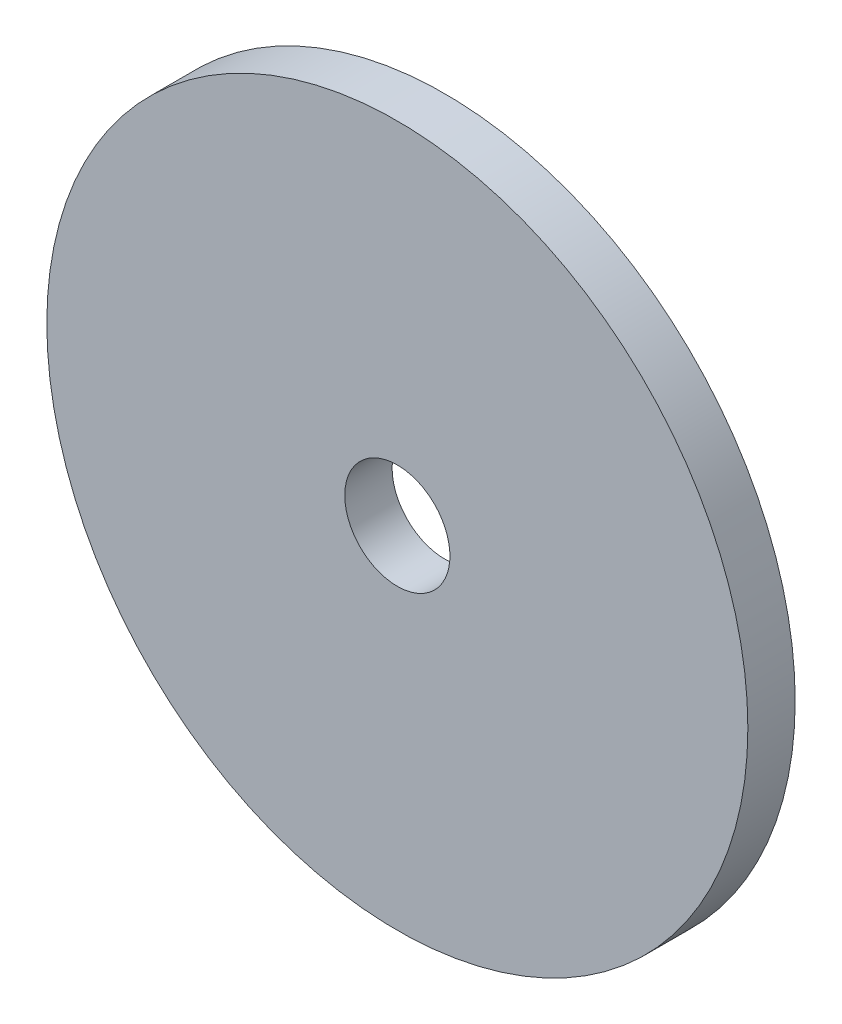
ISO-10303-21;
HEADER;
FILE_DESCRIPTION(('STEP AP214'),'2;1');
FILE_NAME('part.step','',(''),(''),'','','');
FILE_SCHEMA(('AUTOMOTIVE_DESIGN { 1 0 10303 214 1 1 1 1 }'));
ENDSEC;
DATA;
#1=APPLICATION_CONTEXT('core data for automotive mechanical design processes');
#2=APPLICATION_PROTOCOL_DEFINITION('international standard','automotive_design',2000,#1);
#3=PRODUCT_CONTEXT('',#1,'mechanical');
#4=PRODUCT('Part','Part','',(#3));
#5=PRODUCT_RELATED_PRODUCT_CATEGORY('part','',(#4));
#6=PRODUCT_DEFINITION_FORMATION('','',#4);
#7=PRODUCT_DEFINITION_CONTEXT('part definition',#1,'design');
#8=PRODUCT_DEFINITION('design','',#6,#7);
#9=PRODUCT_DEFINITION_SHAPE('','',#8);
#10=(LENGTH_UNIT() NAMED_UNIT(*) SI_UNIT(.MILLI.,.METRE.));
#11=(NAMED_UNIT(*) PLANE_ANGLE_UNIT() SI_UNIT($,.RADIAN.));
#12=(NAMED_UNIT(*) SI_UNIT($,.STERADIAN.) SOLID_ANGLE_UNIT());
#13=UNCERTAINTY_MEASURE_WITH_UNIT(LENGTH_MEASURE(1.E-05),#10,'distance_accuracy_value','');
#14=(GEOMETRIC_REPRESENTATION_CONTEXT(3) GLOBAL_UNCERTAINTY_ASSIGNED_CONTEXT((#13)) GLOBAL_UNIT_ASSIGNED_CONTEXT((#10,
#11,#12)) REPRESENTATION_CONTEXT('',''));
#15=CARTESIAN_POINT('',(0.,0.,0.));
#16=DIRECTION('',(0.,0.,1.));
#17=DIRECTION('',(1.,0.,0.));
#18=AXIS2_PLACEMENT_3D('',#15,#16,#17);
#19=CARTESIAN_POINT('',(-26.0074694451963,-4.9686167072727,2.7));
#20=DIRECTION('',(0.,0.,1.));
#21=DIRECTION('',(1.,0.,0.));
#22=AXIS2_PLACEMENT_3D('',#19,#20,#21);
#23=PLANE('',#22);
#24=CARTESIAN_POINT('',(-26.0074694451963,-4.9686167072727,2.7));
#25=DIRECTION('',(0.,0.,1.));
#26=DIRECTION('',(1.,0.,0.));
#27=AXIS2_PLACEMENT_3D('',#24,#25,#26);
#28=CIRCLE('',#27,20.);
#29=CARTESIAN_POINT('',(-46.0074694451963,-4.9686167072727,2.7));
#30=VERTEX_POINT('',#29);
#31=EDGE_CURVE('E10',#30,#30,#28,.T.);
#32=ORIENTED_EDGE('',*,*,#31,.T.);
#33=EDGE_LOOP('',(#32));
#34=FACE_BOUND('',#33,.T.);
#35=CARTESIAN_POINT('',(-26.0074694451963,-4.9686167072727,2.7));
#36=DIRECTION('',(0.,0.,1.));
#37=DIRECTION('',(1.,0.,0.));
#38=AXIS2_PLACEMENT_3D('',#35,#36,#37);
#39=CIRCLE('',#38,3.);
#40=CARTESIAN_POINT('',(-29.0074694451963,-4.9686167072727,2.7));
#41=VERTEX_POINT('',#40);
#42=EDGE_CURVE('E46',#41,#41,#39,.T.);
#43=ORIENTED_EDGE('',*,*,#42,.F.);
#44=EDGE_LOOP('',(#43));
#45=FACE_BOUND('',#44,.T.);
#46=ADVANCED_FACE('F35',(#34,#45),#23,.T.);
#47=CARTESIAN_POINT('',(-26.0074694451963,-4.9686167072727,0.));
#48=DIRECTION('',(0.,0.,1.));
#49=DIRECTION('',(1.,0.,0.));
#50=AXIS2_PLACEMENT_3D('',#47,#48,#49);
#51=PLANE('',#50);
#52=CARTESIAN_POINT('',(-26.0074694451963,-4.9686167072727,0.));
#53=DIRECTION('',(0.,0.,1.));
#54=DIRECTION('',(1.,0.,0.));
#55=AXIS2_PLACEMENT_3D('',#52,#53,#54);
#56=CIRCLE('',#55,20.);
#57=CARTESIAN_POINT('',(-46.0074694451963,-4.9686167072727,0.));
#58=VERTEX_POINT('',#57);
#59=EDGE_CURVE('E39',#58,#58,#56,.T.);
#60=ORIENTED_EDGE('',*,*,#59,.F.);
#61=EDGE_LOOP('',(#60));
#62=FACE_BOUND('',#61,.T.);
#63=CARTESIAN_POINT('',(-26.0074694451963,-4.9686167072727,0.));
#64=DIRECTION('',(0.,0.,1.));
#65=DIRECTION('',(1.,0.,0.));
#66=AXIS2_PLACEMENT_3D('',#63,#64,#65);
#67=CIRCLE('',#66,3.);
#68=CARTESIAN_POINT('',(-29.0074694451963,-4.9686167072727,0.));
#69=VERTEX_POINT('',#68);
#70=EDGE_CURVE('E48',#69,#69,#67,.T.);
#71=ORIENTED_EDGE('',*,*,#70,.T.);
#72=EDGE_LOOP('',(#71));
#73=FACE_BOUND('',#72,.T.);
#74=ADVANCED_FACE('F58',(#62,#73),#51,.F.);
#75=CARTESIAN_POINT('',(-26.0074694451963,-4.9686167072727,2.7));
#76=DIRECTION('',(0.,0.,-1.));
#77=DIRECTION('',(-1.,0.,0.));
#78=AXIS2_PLACEMENT_3D('',#75,#76,#77);
#79=CYLINDRICAL_SURFACE('',#78,20.);
#80=CARTESIAN_POINT('',(-46.0074694451963,-4.9686167072727,2.7));
#81=CARTESIAN_POINT('',(-46.0074694451963,-4.9686167072727,2.671875));
#82=CARTESIAN_POINT('',(-46.0074694451963,-4.9686167072727,2.64375));
#83=CARTESIAN_POINT('',(-46.0074694451963,-4.9686167072727,2.5875));
#84=CARTESIAN_POINT('',(-46.0074694451963,-4.9686167072727,2.559375));
#85=CARTESIAN_POINT('',(-46.0074694451963,-4.9686167072727,2.503125));
#86=CARTESIAN_POINT('',(-46.0074694451963,-4.9686167072727,2.475));
#87=CARTESIAN_POINT('',(-46.0074694451963,-4.9686167072727,2.41875));
#88=CARTESIAN_POINT('',(-46.0074694451963,-4.9686167072727,2.390625));
#89=CARTESIAN_POINT('',(-46.0074694451963,-4.9686167072727,2.334375));
#90=CARTESIAN_POINT('',(-46.0074694451963,-4.9686167072727,2.30625));
#91=CARTESIAN_POINT('',(-46.0074694451963,-4.9686167072727,2.25));
#92=CARTESIAN_POINT('',(-46.0074694451963,-4.9686167072727,2.221875));
#93=CARTESIAN_POINT('',(-46.0074694451963,-4.9686167072727,2.165625));
#94=CARTESIAN_POINT('',(-46.0074694451963,-4.9686167072727,2.1375));
#95=CARTESIAN_POINT('',(-46.0074694451963,-4.9686167072727,2.08125));
#96=CARTESIAN_POINT('',(-46.0074694451963,-4.9686167072727,2.053125));
#97=CARTESIAN_POINT('',(-46.0074694451963,-4.9686167072727,1.996875));
#98=CARTESIAN_POINT('',(-46.0074694451963,-4.9686167072727,1.96875));
#99=CARTESIAN_POINT('',(-46.0074694451963,-4.9686167072727,1.9125));
#100=CARTESIAN_POINT('',(-46.0074694451963,-4.9686167072727,1.884375));
#101=CARTESIAN_POINT('',(-46.0074694451963,-4.9686167072727,1.828125));
#102=CARTESIAN_POINT('',(-46.0074694451963,-4.9686167072727,1.8));
#103=CARTESIAN_POINT('',(-46.0074694451963,-4.9686167072727,1.74375));
#104=CARTESIAN_POINT('',(-46.0074694451963,-4.9686167072727,1.715625));
#105=CARTESIAN_POINT('',(-46.0074694451963,-4.9686167072727,1.659375));
#106=CARTESIAN_POINT('',(-46.0074694451963,-4.9686167072727,1.63125));
#107=CARTESIAN_POINT('',(-46.0074694451963,-4.9686167072727,1.575));
#108=CARTESIAN_POINT('',(-46.0074694451963,-4.9686167072727,1.546875));
#109=CARTESIAN_POINT('',(-46.0074694451963,-4.9686167072727,1.490625));
#110=CARTESIAN_POINT('',(-46.0074694451963,-4.9686167072727,1.4625));
#111=CARTESIAN_POINT('',(-46.0074694451963,-4.9686167072727,1.40625));
#112=CARTESIAN_POINT('',(-46.0074694451963,-4.9686167072727,1.378125));
#113=CARTESIAN_POINT('',(-46.0074694451963,-4.9686167072727,1.321875));
#114=CARTESIAN_POINT('',(-46.0074694451963,-4.9686167072727,1.29375));
#115=CARTESIAN_POINT('',(-46.0074694451963,-4.9686167072727,1.2375));
#116=CARTESIAN_POINT('',(-46.0074694451963,-4.9686167072727,1.209375));
#117=CARTESIAN_POINT('',(-46.0074694451963,-4.9686167072727,1.153125));
#118=CARTESIAN_POINT('',(-46.0074694451963,-4.9686167072727,1.125));
#119=CARTESIAN_POINT('',(-46.0074694451963,-4.9686167072727,1.06875));
#120=CARTESIAN_POINT('',(-46.0074694451963,-4.9686167072727,1.040625));
#121=CARTESIAN_POINT('',(-46.0074694451963,-4.9686167072727,0.984375));
#122=CARTESIAN_POINT('',(-46.0074694451963,-4.9686167072727,0.95625));
#123=CARTESIAN_POINT('',(-46.0074694451963,-4.9686167072727,0.9));
#124=CARTESIAN_POINT('',(-46.0074694451963,-4.9686167072727,0.871875));
#125=CARTESIAN_POINT('',(-46.0074694451963,-4.9686167072727,0.815625));
#126=CARTESIAN_POINT('',(-46.0074694451963,-4.9686167072727,0.7875));
#127=CARTESIAN_POINT('',(-46.0074694451963,-4.9686167072727,0.73125));
#128=CARTESIAN_POINT('',(-46.0074694451963,-4.9686167072727,0.703125));
#129=CARTESIAN_POINT('',(-46.0074694451963,-4.9686167072727,0.646875));
#130=CARTESIAN_POINT('',(-46.0074694451963,-4.9686167072727,0.61875));
#131=CARTESIAN_POINT('',(-46.0074694451963,-4.9686167072727,0.5625));
#132=CARTESIAN_POINT('',(-46.0074694451963,-4.9686167072727,0.534375));
#133=CARTESIAN_POINT('',(-46.0074694451963,-4.9686167072727,0.478125));
#134=CARTESIAN_POINT('',(-46.0074694451963,-4.9686167072727,0.45));
#135=CARTESIAN_POINT('',(-46.0074694451963,-4.9686167072727,0.39375));
#136=CARTESIAN_POINT('',(-46.0074694451963,-4.9686167072727,0.365625));
#137=CARTESIAN_POINT('',(-46.0074694451963,-4.9686167072727,0.309375));
#138=CARTESIAN_POINT('',(-46.0074694451963,-4.9686167072727,0.28125));
#139=CARTESIAN_POINT('',(-46.0074694451963,-4.9686167072727,0.225));
#140=CARTESIAN_POINT('',(-46.0074694451963,-4.9686167072727,0.196875));
#141=CARTESIAN_POINT('',(-46.0074694451963,-4.9686167072727,0.140625));
#142=CARTESIAN_POINT('',(-46.0074694451963,-4.9686167072727,0.112499999999999));
#143=CARTESIAN_POINT('',(-46.0074694451963,-4.9686167072727,0.0562499999999994));
#144=CARTESIAN_POINT('',(-46.0074694451963,-4.9686167072727,0.0281249999999995));
#145=CARTESIAN_POINT('',(-46.0074694451963,-4.9686167072727,0.));
#146=B_SPLINE_CURVE_WITH_KNOTS('',3,(#80,#81,#82,#83,#84,#85,#86,#87,#88,#89,#90,#91,#92,#93,
#94,#95,#96,#97,#98,#99,#100,#101,#102,#103,#104,#105,#106,#107,#108,#109,#110,#111,#112,#113,
#114,#115,#116,#117,#118,#119,#120,#121,#122,#123,#124,#125,#126,#127,#128,#129,#130,#131,#132,
#133,#134,#135,#136,#137,#138,#139,#140,#141,#142,#143,#144,#145),.UNSPECIFIED.,.F.,.F.,(4,2,2,
2,2,2,2,2,2,2,2,2,2,2,2,2,2,2,2,2,2,2,2,2,2,2,2,2,2,2,2,2,4),(0.,0.0843749999999998,0.16875,
0.253125,0.3375,0.421875,0.50625,0.590625,0.675,0.759375,0.84375,0.928125,1.0125,1.096875,
1.18125,1.265625,1.35,1.434375,1.51875,1.603125,1.6875,1.771875,1.85625,1.940625,2.025,2.109375,
2.19375,2.278125,2.3625,2.446875,2.53125,2.615625,2.7),.UNSPECIFIED.);
#147=EDGE_CURVE('BSEAM37',#30,#58,#146,.T.);
#148=ORIENTED_EDGE('',*,*,#31,.F.);
#149=ORIENTED_EDGE('',*,*,#59,.T.);
#150=ORIENTED_EDGE('',*,*,#147,.T.);
#151=ORIENTED_EDGE('',*,*,#147,.F.);
#152=EDGE_LOOP('',(#148,#150,#149,#151));
#153=FACE_BOUND('',#152,.T.);
#154=ADVANCED_FACE('F37',(#153),#79,.T.);
#155=CARTESIAN_POINT('',(-26.0074694451963,-4.9686167072727,2.7));
#156=DIRECTION('',(0.,0.,-1.));
#157=DIRECTION('',(-1.,0.,0.));
#158=AXIS2_PLACEMENT_3D('',#155,#156,#157);
#159=CYLINDRICAL_SURFACE('',#158,3.);
#160=CARTESIAN_POINT('',(-29.0074694451963,-4.9686167072727,2.7));
#161=CARTESIAN_POINT('',(-29.0074694451963,-4.9686167072727,2.671875));
#162=CARTESIAN_POINT('',(-29.0074694451963,-4.9686167072727,2.64375));
#163=CARTESIAN_POINT('',(-29.0074694451963,-4.9686167072727,2.5875));
#164=CARTESIAN_POINT('',(-29.0074694451963,-4.9686167072727,2.559375));
#165=CARTESIAN_POINT('',(-29.0074694451963,-4.9686167072727,2.503125));
#166=CARTESIAN_POINT('',(-29.0074694451963,-4.9686167072727,2.475));
#167=CARTESIAN_POINT('',(-29.0074694451963,-4.9686167072727,2.41875));
#168=CARTESIAN_POINT('',(-29.0074694451963,-4.9686167072727,2.390625));
#169=CARTESIAN_POINT('',(-29.0074694451963,-4.9686167072727,2.334375));
#170=CARTESIAN_POINT('',(-29.0074694451963,-4.9686167072727,2.30625));
#171=CARTESIAN_POINT('',(-29.0074694451963,-4.9686167072727,2.25));
#172=CARTESIAN_POINT('',(-29.0074694451963,-4.9686167072727,2.221875));
#173=CARTESIAN_POINT('',(-29.0074694451963,-4.9686167072727,2.165625));
#174=CARTESIAN_POINT('',(-29.0074694451963,-4.9686167072727,2.1375));
#175=CARTESIAN_POINT('',(-29.0074694451963,-4.9686167072727,2.08125));
#176=CARTESIAN_POINT('',(-29.0074694451963,-4.9686167072727,2.053125));
#177=CARTESIAN_POINT('',(-29.0074694451963,-4.9686167072727,1.996875));
#178=CARTESIAN_POINT('',(-29.0074694451963,-4.9686167072727,1.96875));
#179=CARTESIAN_POINT('',(-29.0074694451963,-4.9686167072727,1.9125));
#180=CARTESIAN_POINT('',(-29.0074694451963,-4.9686167072727,1.884375));
#181=CARTESIAN_POINT('',(-29.0074694451963,-4.9686167072727,1.828125));
#182=CARTESIAN_POINT('',(-29.0074694451963,-4.9686167072727,1.8));
#183=CARTESIAN_POINT('',(-29.0074694451963,-4.9686167072727,1.74375));
#184=CARTESIAN_POINT('',(-29.0074694451963,-4.9686167072727,1.715625));
#185=CARTESIAN_POINT('',(-29.0074694451963,-4.9686167072727,1.659375));
#186=CARTESIAN_POINT('',(-29.0074694451963,-4.9686167072727,1.63125));
#187=CARTESIAN_POINT('',(-29.0074694451963,-4.9686167072727,1.575));
#188=CARTESIAN_POINT('',(-29.0074694451963,-4.9686167072727,1.546875));
#189=CARTESIAN_POINT('',(-29.0074694451963,-4.9686167072727,1.490625));
#190=CARTESIAN_POINT('',(-29.0074694451963,-4.9686167072727,1.4625));
#191=CARTESIAN_POINT('',(-29.0074694451963,-4.9686167072727,1.40625));
#192=CARTESIAN_POINT('',(-29.0074694451963,-4.9686167072727,1.378125));
#193=CARTESIAN_POINT('',(-29.0074694451963,-4.9686167072727,1.321875));
#194=CARTESIAN_POINT('',(-29.0074694451963,-4.9686167072727,1.29375));
#195=CARTESIAN_POINT('',(-29.0074694451963,-4.9686167072727,1.2375));
#196=CARTESIAN_POINT('',(-29.0074694451963,-4.9686167072727,1.209375));
#197=CARTESIAN_POINT('',(-29.0074694451963,-4.9686167072727,1.153125));
#198=CARTESIAN_POINT('',(-29.0074694451963,-4.9686167072727,1.125));
#199=CARTESIAN_POINT('',(-29.0074694451963,-4.9686167072727,1.06875));
#200=CARTESIAN_POINT('',(-29.0074694451963,-4.9686167072727,1.040625));
#201=CARTESIAN_POINT('',(-29.0074694451963,-4.9686167072727,0.984375));
#202=CARTESIAN_POINT('',(-29.0074694451963,-4.9686167072727,0.95625));
#203=CARTESIAN_POINT('',(-29.0074694451963,-4.9686167072727,0.9));
#204=CARTESIAN_POINT('',(-29.0074694451963,-4.9686167072727,0.871875));
#205=CARTESIAN_POINT('',(-29.0074694451963,-4.9686167072727,0.815625));
#206=CARTESIAN_POINT('',(-29.0074694451963,-4.9686167072727,0.7875));
#207=CARTESIAN_POINT('',(-29.0074694451963,-4.9686167072727,0.73125));
#208=CARTESIAN_POINT('',(-29.0074694451963,-4.9686167072727,0.703125));
#209=CARTESIAN_POINT('',(-29.0074694451963,-4.9686167072727,0.646875));
#210=CARTESIAN_POINT('',(-29.0074694451963,-4.9686167072727,0.61875));
#211=CARTESIAN_POINT('',(-29.0074694451963,-4.9686167072727,0.5625));
#212=CARTESIAN_POINT('',(-29.0074694451963,-4.9686167072727,0.534375));
#213=CARTESIAN_POINT('',(-29.0074694451963,-4.9686167072727,0.478125));
#214=CARTESIAN_POINT('',(-29.0074694451963,-4.9686167072727,0.45));
#215=CARTESIAN_POINT('',(-29.0074694451963,-4.9686167072727,0.39375));
#216=CARTESIAN_POINT('',(-29.0074694451963,-4.9686167072727,0.365625));
#217=CARTESIAN_POINT('',(-29.0074694451963,-4.9686167072727,0.309375));
#218=CARTESIAN_POINT('',(-29.0074694451963,-4.9686167072727,0.28125));
#219=CARTESIAN_POINT('',(-29.0074694451963,-4.9686167072727,0.225));
#220=CARTESIAN_POINT('',(-29.0074694451963,-4.9686167072727,0.196875));
#221=CARTESIAN_POINT('',(-29.0074694451963,-4.9686167072727,0.140625));
#222=CARTESIAN_POINT('',(-29.0074694451963,-4.9686167072727,0.112499999999999));
#223=CARTESIAN_POINT('',(-29.0074694451963,-4.9686167072727,0.0562499999999994));
#224=CARTESIAN_POINT('',(-29.0074694451963,-4.9686167072727,0.0281249999999995));
#225=CARTESIAN_POINT('',(-29.0074694451963,-4.9686167072727,0.));
#226=B_SPLINE_CURVE_WITH_KNOTS('',3,(#160,#161,#162,#163,#164,#165,#166,#167,#168,#169,#170,
#171,#172,#173,#174,#175,#176,#177,#178,#179,#180,#181,#182,#183,#184,#185,#186,#187,#188,#189,
#190,#191,#192,#193,#194,#195,#196,#197,#198,#199,#200,#201,#202,#203,#204,#205,#206,#207,#208,
#209,#210,#211,#212,#213,#214,#215,#216,#217,#218,#219,#220,#221,#222,#223,#224,#225),
.UNSPECIFIED.,.F.,.F.,(4,2,2,2,2,2,2,2,2,2,2,2,2,2,2,2,2,2,2,2,2,2,2,2,2,2,2,2,2,2,2,2,4),(0.,
0.0843749999999998,0.16875,0.253125,0.3375,0.421875,0.50625,0.590625,0.675,0.759375,0.84375,
0.928125,1.0125,1.096875,1.18125,1.265625,1.35,1.434375,1.51875,1.603125,1.6875,1.771875,
1.85625,1.940625,2.025,2.109375,2.19375,2.278125,2.3625,2.446875,2.53125,2.615625,2.7),.UNSPECIFIED.);
#227=EDGE_CURVE('BSEAM54',#41,#69,#226,.T.);
#228=ORIENTED_EDGE('',*,*,#42,.T.);
#229=ORIENTED_EDGE('',*,*,#70,.F.);
#230=ORIENTED_EDGE('',*,*,#227,.T.);
#231=ORIENTED_EDGE('',*,*,#227,.F.);
#232=EDGE_LOOP('',(#228,#230,#229,#231));
#233=FACE_BOUND('',#232,.T.);
#234=ADVANCED_FACE('F54',(#233),#159,.F.);
#235=CLOSED_SHELL('',(#46,#74,#154,#234));
#236=MANIFOLD_SOLID_BREP('B2',#235);
#237=ADVANCED_BREP_SHAPE_REPRESENTATION('',(#18,#236),#14);
#238=SHAPE_DEFINITION_REPRESENTATION(#9,#237);
ENDSEC;
END-ISO-10303-21;
